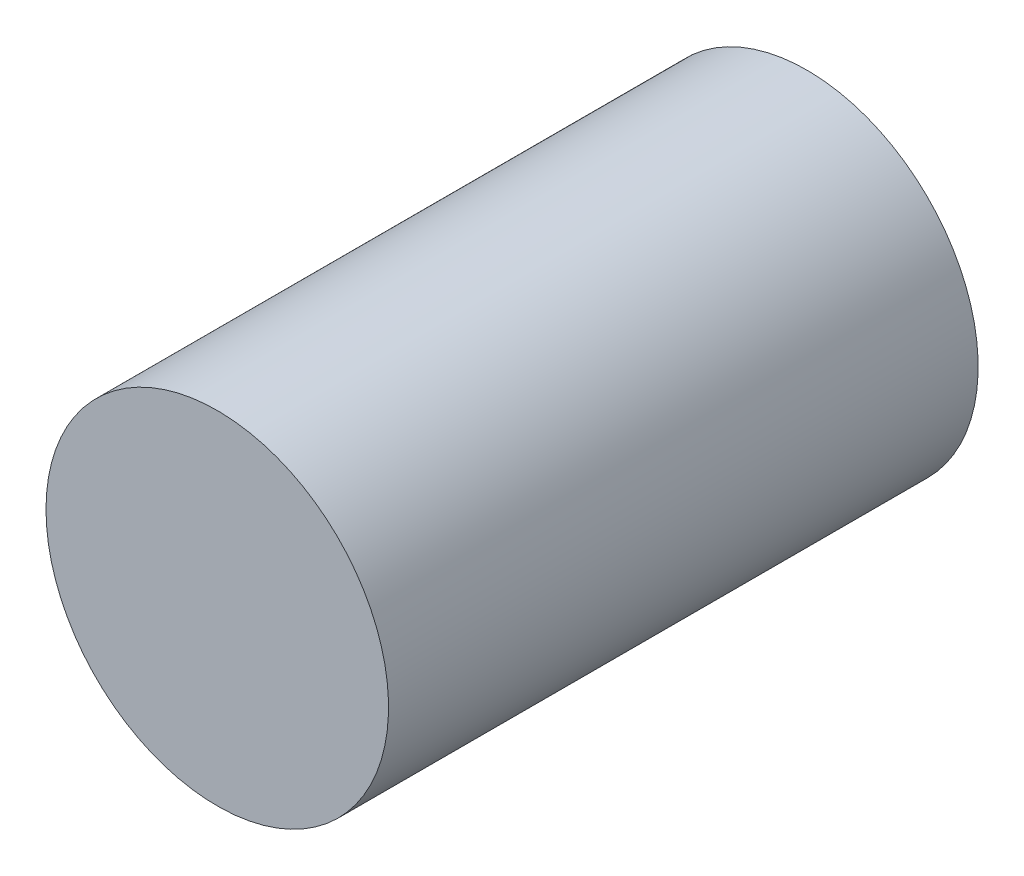
ISO-10303-21;
HEADER;
FILE_DESCRIPTION(('STEP AP214'),'2;1');
FILE_NAME('part.step','',(''),(''),'','','');
FILE_SCHEMA(('AUTOMOTIVE_DESIGN { 1 0 10303 214 1 1 1 1 }'));
ENDSEC;
DATA;
#1=APPLICATION_CONTEXT('core data for automotive mechanical design processes');
#2=APPLICATION_PROTOCOL_DEFINITION('international standard','automotive_design',2000,#1);
#3=PRODUCT_CONTEXT('',#1,'mechanical');
#4=PRODUCT('Part','Part','',(#3));
#5=PRODUCT_RELATED_PRODUCT_CATEGORY('part','',(#4));
#6=PRODUCT_DEFINITION_FORMATION('','',#4);
#7=PRODUCT_DEFINITION_CONTEXT('part definition',#1,'design');
#8=PRODUCT_DEFINITION('design','',#6,#7);
#9=PRODUCT_DEFINITION_SHAPE('','',#8);
#10=(LENGTH_UNIT() NAMED_UNIT(*) SI_UNIT(.MILLI.,.METRE.));
#11=(NAMED_UNIT(*) PLANE_ANGLE_UNIT() SI_UNIT($,.RADIAN.));
#12=(NAMED_UNIT(*) SI_UNIT($,.STERADIAN.) SOLID_ANGLE_UNIT());
#13=UNCERTAINTY_MEASURE_WITH_UNIT(LENGTH_MEASURE(1.E-05),#10,'distance_accuracy_value','');
#14=(GEOMETRIC_REPRESENTATION_CONTEXT(3) GLOBAL_UNCERTAINTY_ASSIGNED_CONTEXT((#13)) GLOBAL_UNIT_ASSIGNED_CONTEXT((#10,
#11,#12)) REPRESENTATION_CONTEXT('',''));
#15=CARTESIAN_POINT('',(0.,0.,0.));
#16=DIRECTION('',(0.,0.,1.));
#17=DIRECTION('',(1.,0.,0.));
#18=AXIS2_PLACEMENT_3D('',#15,#16,#17);
#19=CARTESIAN_POINT('',(0.,0.,21.));
#20=DIRECTION('',(0.,0.,-1.));
#21=DIRECTION('',(-1.,0.,0.));
#22=AXIS2_PLACEMENT_3D('',#19,#20,#21);
#23=CYLINDRICAL_SURFACE('',#22,6.1);
#24=CARTESIAN_POINT('',(0.,0.,21.));
#25=DIRECTION('',(0.,0.,1.));
#26=DIRECTION('',(1.,0.,0.));
#27=AXIS2_PLACEMENT_3D('',#24,#25,#26);
#28=CIRCLE('',#27,6.1);
#29=CARTESIAN_POINT('',(-6.1,0.,21.));
#30=VERTEX_POINT('',#29);
#31=EDGE_CURVE('E10',#30,#30,#28,.T.);
#32=CARTESIAN_POINT('',(0.,0.,0.));
#33=DIRECTION('',(0.,0.,1.));
#34=DIRECTION('',(1.,0.,0.));
#35=AXIS2_PLACEMENT_3D('',#32,#33,#34);
#36=CIRCLE('',#35,6.1);
#37=CARTESIAN_POINT('',(-6.1,0.,0.));
#38=VERTEX_POINT('',#37);
#39=EDGE_CURVE('E40',#38,#38,#36,.T.);
#40=CARTESIAN_POINT('',(-6.1,0.,21.));
#41=CARTESIAN_POINT('',(-6.1,0.,20.78125));
#42=CARTESIAN_POINT('',(-6.1,0.,20.5625));
#43=CARTESIAN_POINT('',(-6.1,0.,20.125));
#44=CARTESIAN_POINT('',(-6.1,0.,19.90625));
#45=CARTESIAN_POINT('',(-6.1,0.,19.46875));
#46=CARTESIAN_POINT('',(-6.1,0.,19.25));
#47=CARTESIAN_POINT('',(-6.1,0.,18.8125));
#48=CARTESIAN_POINT('',(-6.1,0.,18.59375));
#49=CARTESIAN_POINT('',(-6.1,0.,18.15625));
#50=CARTESIAN_POINT('',(-6.1,0.,17.9375));
#51=CARTESIAN_POINT('',(-6.1,0.,17.5));
#52=CARTESIAN_POINT('',(-6.1,0.,17.28125));
#53=CARTESIAN_POINT('',(-6.1,0.,16.84375));
#54=CARTESIAN_POINT('',(-6.1,0.,16.625));
#55=CARTESIAN_POINT('',(-6.1,0.,16.1875));
#56=CARTESIAN_POINT('',(-6.1,0.,15.96875));
#57=CARTESIAN_POINT('',(-6.1,0.,15.53125));
#58=CARTESIAN_POINT('',(-6.1,0.,15.3125));
#59=CARTESIAN_POINT('',(-6.1,0.,14.875));
#60=CARTESIAN_POINT('',(-6.1,0.,14.65625));
#61=CARTESIAN_POINT('',(-6.1,0.,14.21875));
#62=CARTESIAN_POINT('',(-6.1,0.,14.));
#63=CARTESIAN_POINT('',(-6.1,0.,13.5625));
#64=CARTESIAN_POINT('',(-6.1,0.,13.34375));
#65=CARTESIAN_POINT('',(-6.1,0.,12.90625));
#66=CARTESIAN_POINT('',(-6.1,0.,12.6875));
#67=CARTESIAN_POINT('',(-6.1,0.,12.25));
#68=CARTESIAN_POINT('',(-6.1,0.,12.03125));
#69=CARTESIAN_POINT('',(-6.1,0.,11.59375));
#70=CARTESIAN_POINT('',(-6.1,0.,11.375));
#71=CARTESIAN_POINT('',(-6.1,0.,10.9375));
#72=CARTESIAN_POINT('',(-6.1,0.,10.71875));
#73=CARTESIAN_POINT('',(-6.1,0.,10.28125));
#74=CARTESIAN_POINT('',(-6.1,0.,10.0625));
#75=CARTESIAN_POINT('',(-6.1,0.,9.625));
#76=CARTESIAN_POINT('',(-6.1,0.,9.40625));
#77=CARTESIAN_POINT('',(-6.1,0.,8.96875));
#78=CARTESIAN_POINT('',(-6.1,0.,8.75));
#79=CARTESIAN_POINT('',(-6.1,0.,8.3125));
#80=CARTESIAN_POINT('',(-6.1,0.,8.09375));
#81=CARTESIAN_POINT('',(-6.1,0.,7.65625));
#82=CARTESIAN_POINT('',(-6.1,0.,7.4375));
#83=CARTESIAN_POINT('',(-6.1,0.,7.));
#84=CARTESIAN_POINT('',(-6.1,0.,6.78125));
#85=CARTESIAN_POINT('',(-6.1,0.,6.34375));
#86=CARTESIAN_POINT('',(-6.1,0.,6.125));
#87=CARTESIAN_POINT('',(-6.1,0.,5.6875));
#88=CARTESIAN_POINT('',(-6.1,0.,5.46875));
#89=CARTESIAN_POINT('',(-6.1,0.,5.03125));
#90=CARTESIAN_POINT('',(-6.1,0.,4.8125));
#91=CARTESIAN_POINT('',(-6.1,0.,4.375));
#92=CARTESIAN_POINT('',(-6.1,0.,4.15625));
#93=CARTESIAN_POINT('',(-6.1,0.,3.71875));
#94=CARTESIAN_POINT('',(-6.1,0.,3.5));
#95=CARTESIAN_POINT('',(-6.1,0.,3.0625));
#96=CARTESIAN_POINT('',(-6.1,0.,2.84375));
#97=CARTESIAN_POINT('',(-6.1,0.,2.40625));
#98=CARTESIAN_POINT('',(-6.1,0.,2.1875));
#99=CARTESIAN_POINT('',(-6.1,0.,1.75));
#100=CARTESIAN_POINT('',(-6.1,0.,1.53125));
#101=CARTESIAN_POINT('',(-6.1,0.,1.09375));
#102=CARTESIAN_POINT('',(-6.1,0.,0.875000000000001));
#103=CARTESIAN_POINT('',(-6.1,0.,0.4375));
#104=CARTESIAN_POINT('',(-6.1,0.,0.21875));
#105=CARTESIAN_POINT('',(-6.1,0.,0.));
#106=B_SPLINE_CURVE_WITH_KNOTS('',3,(#40,#41,#42,#43,#44,#45,#46,#47,#48,#49,#50,#51,#52,#53,
#54,#55,#56,#57,#58,#59,#60,#61,#62,#63,#64,#65,#66,#67,#68,#69,#70,#71,#72,#73,#74,#75,#76,#77,
#78,#79,#80,#81,#82,#83,#84,#85,#86,#87,#88,#89,#90,#91,#92,#93,#94,#95,#96,#97,#98,#99,#100,
#101,#102,#103,#104,#105),.UNSPECIFIED.,.F.,.F.,(4,2,2,2,2,2,2,2,2,2,2,2,2,2,2,2,2,2,2,2,2,2,2,
2,2,2,2,2,2,2,2,2,4),(0.,0.656250000000001,1.3125,1.96875,2.625,3.28125,3.9375,4.59375,5.25,
5.90625,6.5625,7.21875,7.875,8.53125,9.1875,9.84375,10.5,11.15625,11.8125,12.46875,13.125,
13.78125,14.4375,15.09375,15.75,16.40625,17.0625,17.71875,18.375,19.03125,19.6875,20.34375,21.),.UNSPECIFIED.);
#107=EDGE_CURVE('BSEAM37',#30,#38,#106,.T.);
#108=ORIENTED_EDGE('',*,*,#31,.F.);
#109=ORIENTED_EDGE('',*,*,#39,.T.);
#110=ORIENTED_EDGE('',*,*,#107,.T.);
#111=ORIENTED_EDGE('',*,*,#107,.F.);
#112=EDGE_LOOP('',(#108,#110,#109,#111));
#113=FACE_BOUND('',#112,.T.);
#114=ADVANCED_FACE('F37',(#113),#23,.T.);
#115=CARTESIAN_POINT('',(0.,0.,21.));
#116=DIRECTION('',(0.,0.,1.));
#117=DIRECTION('',(1.,0.,0.));
#118=AXIS2_PLACEMENT_3D('',#115,#116,#117);
#119=PLANE('',#118);
#120=ORIENTED_EDGE('',*,*,#31,.T.);
#121=EDGE_LOOP('',(#120));
#122=FACE_BOUND('',#121,.T.);
#123=ADVANCED_FACE('F52',(#122),#119,.T.);
#124=CARTESIAN_POINT('',(0.,0.,0.));
#125=DIRECTION('',(0.,0.,1.));
#126=DIRECTION('',(1.,0.,0.));
#127=AXIS2_PLACEMENT_3D('',#124,#125,#126);
#128=PLANE('',#127);
#129=ORIENTED_EDGE('',*,*,#39,.F.);
#130=EDGE_LOOP('',(#129));
#131=FACE_BOUND('',#130,.T.);
#132=ADVANCED_FACE('F50',(#131),#128,.F.);
#133=CLOSED_SHELL('',(#114,#123,#132));
#134=MANIFOLD_SOLID_BREP('B2',#133);
#135=ADVANCED_BREP_SHAPE_REPRESENTATION('',(#18,#134),#14);
#136=SHAPE_DEFINITION_REPRESENTATION(#9,#135);
ENDSEC;
END-ISO-10303-21;
